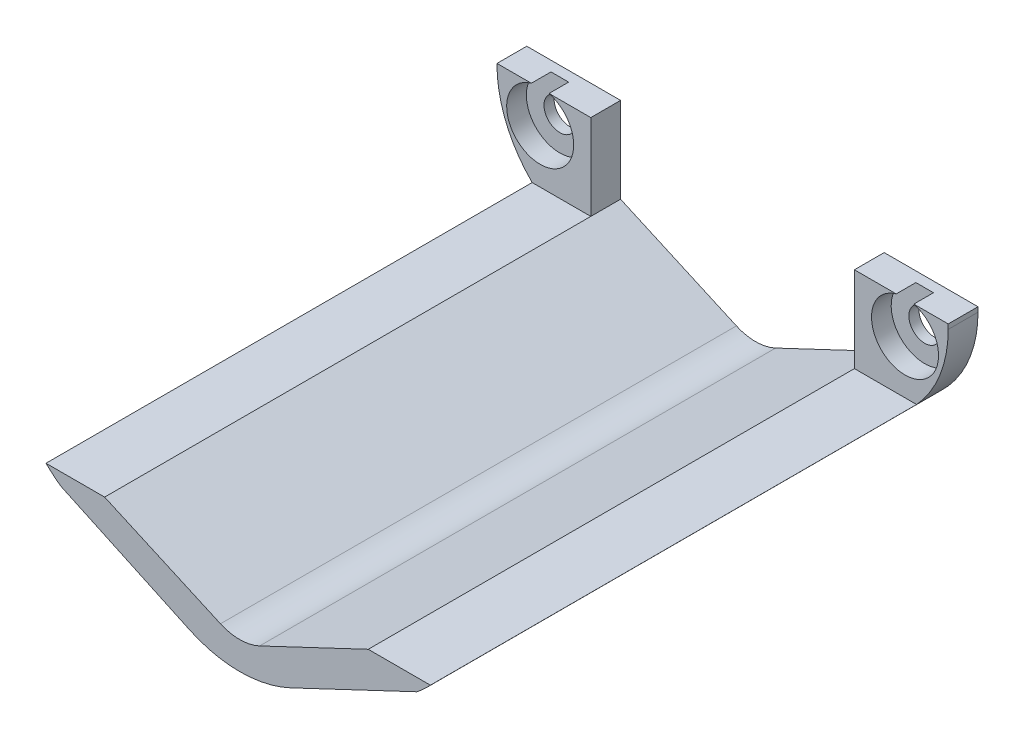
ISO-10303-21;
HEADER;
FILE_DESCRIPTION(('STEP AP214'),'2;1');
FILE_NAME('part.step','',(''),(''),'','','');
FILE_SCHEMA(('AUTOMOTIVE_DESIGN { 1 0 10303 214 1 1 1 1 }'));
ENDSEC;
DATA;
#1=APPLICATION_CONTEXT('core data for automotive mechanical design processes');
#2=APPLICATION_PROTOCOL_DEFINITION('international standard','automotive_design',2000,#1);
#3=PRODUCT_CONTEXT('',#1,'mechanical');
#4=PRODUCT('Part','Part','',(#3));
#5=PRODUCT_RELATED_PRODUCT_CATEGORY('part','',(#4));
#6=PRODUCT_DEFINITION_FORMATION('','',#4);
#7=PRODUCT_DEFINITION_CONTEXT('part definition',#1,'design');
#8=PRODUCT_DEFINITION('design','',#6,#7);
#9=PRODUCT_DEFINITION_SHAPE('','',#8);
#10=(LENGTH_UNIT() NAMED_UNIT(*) SI_UNIT(.MILLI.,.METRE.));
#11=(NAMED_UNIT(*) PLANE_ANGLE_UNIT() SI_UNIT($,.RADIAN.));
#12=(NAMED_UNIT(*) SI_UNIT($,.STERADIAN.) SOLID_ANGLE_UNIT());
#13=UNCERTAINTY_MEASURE_WITH_UNIT(LENGTH_MEASURE(1.E-05),#10,'distance_accuracy_value','');
#14=(GEOMETRIC_REPRESENTATION_CONTEXT(3) GLOBAL_UNCERTAINTY_ASSIGNED_CONTEXT((#13)) GLOBAL_UNIT_ASSIGNED_CONTEXT((#10,
#11,#12)) REPRESENTATION_CONTEXT('',''));
#15=CARTESIAN_POINT('',(0.,0.,0.));
#16=DIRECTION('',(0.,0.,1.));
#17=DIRECTION('',(1.,0.,0.));
#18=AXIS2_PLACEMENT_3D('',#15,#16,#17);
#19=CARTESIAN_POINT('',(-48.895,-29.2595762195122,130.6375));
#20=DIRECTION('',(1.,0.,0.));
#21=DIRECTION('',(0.,0.,-1.));
#22=AXIS2_PLACEMENT_3D('',#19,#20,#21);
#23=PLANE('',#22);
#24=DIRECTION('',(0.,-1.,0.));
#25=VECTOR('',#24,1.);
#26=CARTESIAN_POINT('',(-48.895,-29.2595762195122,26.9875));
#27=LINE('',#26,#25);
#28=CARTESIAN_POINT('',(-48.895,-29.2595762195122,26.9875));
#29=VERTEX_POINT('',#28);
#30=CARTESIAN_POINT('',(-48.895,-29.4891291976606,26.9875));
#31=VERTEX_POINT('',#30);
#32=EDGE_CURVE('E324',#29,#31,#27,.T.);
#33=ORIENTED_EDGE('',*,*,#32,.F.);
#34=DIRECTION('',(0.,0.,-1.));
#35=VECTOR('',#34,1.);
#36=CARTESIAN_POINT('',(-48.895,-29.2595762195122,130.6375));
#37=LINE('',#36,#35);
#38=CARTESIAN_POINT('',(-48.895,-29.2595762195122,20.6375));
#39=VERTEX_POINT('',#38);
#40=EDGE_CURVE('E263',#29,#39,#37,.T.);
#41=ORIENTED_EDGE('',*,*,#40,.T.);
#42=DIRECTION('',(0.,-1.,0.));
#43=VECTOR('',#42,1.);
#44=CARTESIAN_POINT('',(-48.895,-29.2595762195122,20.6375));
#45=LINE('',#44,#43);
#46=CARTESIAN_POINT('',(-48.895,-29.4891291976606,20.6375));
#47=VERTEX_POINT('',#46);
#48=EDGE_CURVE('E294',#39,#47,#45,.T.);
#49=ORIENTED_EDGE('',*,*,#48,.T.);
#50=DIRECTION('',(0.,0.,-1.));
#51=VECTOR('',#50,1.);
#52=CARTESIAN_POINT('',(-48.895,-29.4891291976606,130.6375));
#53=LINE('',#52,#51);
#54=EDGE_CURVE('E220',#47,#31,#53,.F.);
#55=ORIENTED_EDGE('',*,*,#54,.T.);
#56=EDGE_LOOP('',(#33,#41,#49,#55));
#57=FACE_BOUND('',#56,.T.);
#58=ADVANCED_FACE('F33',(#57),#23,.F.);
#59=CARTESIAN_POINT('',(-28.895,-29.2595762195122,130.6375));
#60=DIRECTION('',(1.,0.,0.));
#61=DIRECTION('',(0.,1.,0.));
#62=AXIS2_PLACEMENT_3D('',#59,#60,#61);
#63=PLANE('',#62);
#64=DIRECTION('',(0.,0.,-1.));
#65=VECTOR('',#64,1.);
#66=CARTESIAN_POINT('',(-28.895,-29.2595762195122,130.6375));
#67=LINE('',#66,#65);
#68=CARTESIAN_POINT('',(-28.895,-29.2595762195122,26.9875));
#69=VERTEX_POINT('',#68);
#70=CARTESIAN_POINT('',(-28.895,-29.2595762195122,20.6375));
#71=VERTEX_POINT('',#70);
#72=EDGE_CURVE('E261',#69,#71,#67,.T.);
#73=ORIENTED_EDGE('',*,*,#72,.F.);
#74=DIRECTION('',(0.,1.,0.));
#75=VECTOR('',#74,1.);
#76=CARTESIAN_POINT('',(-28.895,-47.5095762195122,26.9875));
#77=LINE('',#76,#75);
#78=CARTESIAN_POINT('',(-28.895,-47.5095762195122,26.9875));
#79=VERTEX_POINT('',#78);
#80=EDGE_CURVE('E321',#79,#69,#77,.T.);
#81=ORIENTED_EDGE('',*,*,#80,.F.);
#82=DIRECTION('',(0.,0.,-1.));
#83=VECTOR('',#82,1.);
#84=CARTESIAN_POINT('',(-28.895,-47.5095762195122,130.6375));
#85=LINE('',#84,#83);
#86=CARTESIAN_POINT('',(-28.895,-47.5095762195122,20.6375));
#87=VERTEX_POINT('',#86);
#88=EDGE_CURVE('E260',#79,#87,#85,.T.);
#89=ORIENTED_EDGE('',*,*,#88,.T.);
#90=DIRECTION('',(0.,-1.,0.));
#91=VECTOR('',#90,1.);
#92=CARTESIAN_POINT('',(-28.895,-29.2595762195122,20.6375));
#93=LINE('',#92,#91);
#94=EDGE_CURVE('E270',#71,#87,#93,.T.);
#95=ORIENTED_EDGE('',*,*,#94,.F.);
#96=EDGE_LOOP('',(#73,#81,#89,#95));
#97=FACE_BOUND('',#96,.T.);
#98=ADVANCED_FACE('F357',(#97),#63,.T.);
#99=CARTESIAN_POINT('',(-48.895,-29.2595762195122,130.6375));
#100=DIRECTION('',(0.,1.,0.));
#101=DIRECTION('',(-1.,0.,0.));
#102=AXIS2_PLACEMENT_3D('',#99,#100,#101);
#103=PLANE('',#102);
#104=DIRECTION('',(0.,0.,1.));
#105=VECTOR('',#104,1.);
#106=CARTESIAN_POINT('',(-41.5720781813428,-29.2595762195122,26.9875));
#107=LINE('',#106,#105);
#108=CARTESIAN_POINT('',(-41.5720781813428,-29.2595762195122,22.7965));
#109=VERTEX_POINT('',#108);
#110=CARTESIAN_POINT('',(-41.5720781813428,-29.2595762195122,26.9875));
#111=VERTEX_POINT('',#110);
#112=EDGE_CURVE('E11',#109,#111,#107,.T.);
#113=ORIENTED_EDGE('',*,*,#112,.F.);
#114=DIRECTION('',(-1.,0.,0.));
#115=VECTOR('',#114,1.);
#116=CARTESIAN_POINT('',(-48.895,-29.2595762195122,22.7965));
#117=LINE('',#116,#115);
#118=CARTESIAN_POINT('',(-37.7979218186573,-29.2595762195122,22.7965));
#119=VERTEX_POINT('',#118);
#120=EDGE_CURVE('E41',#119,#109,#117,.T.);
#121=ORIENTED_EDGE('',*,*,#120,.F.);
#122=DIRECTION('',(0.,0.,1.));
#123=VECTOR('',#122,1.);
#124=CARTESIAN_POINT('',(-37.7979218186573,-29.2595762195122,26.9875));
#125=LINE('',#124,#123);
#126=CARTESIAN_POINT('',(-37.7979218186573,-29.2595762195122,26.9875));
#127=VERTEX_POINT('',#126);
#128=EDGE_CURVE('E173',#127,#119,#125,.F.);
#129=ORIENTED_EDGE('',*,*,#128,.F.);
#130=DIRECTION('',(-1.,0.,0.));
#131=VECTOR('',#130,1.);
#132=CARTESIAN_POINT('',(-28.895,-29.2595762195122,26.9875));
#133=LINE('',#132,#131);
#134=EDGE_CURVE('E326',#69,#127,#133,.T.);
#135=ORIENTED_EDGE('',*,*,#134,.F.);
#136=ORIENTED_EDGE('',*,*,#72,.T.);
#137=DIRECTION('',(1.,0.,0.));
#138=VECTOR('',#137,1.);
#139=CARTESIAN_POINT('',(-48.895,-29.2595762195122,20.6375));
#140=LINE('',#139,#138);
#141=EDGE_CURVE('E266',#39,#71,#140,.T.);
#142=ORIENTED_EDGE('',*,*,#141,.F.);
#143=ORIENTED_EDGE('',*,*,#40,.F.);
#144=EDGE_CURVE('E328',#111,#29,#133,.T.);
#145=ORIENTED_EDGE('',*,*,#144,.F.);
#146=EDGE_LOOP('',(#113,#121,#129,#135,#136,#142,#143,#145));
#147=FACE_BOUND('',#146,.T.);
#148=ADVANCED_FACE('F189',(#147),#103,.T.);
#149=CARTESIAN_POINT('',(47.3075,-29.2595762195122,130.6375));
#150=DIRECTION('',(1.,0.,0.));
#151=DIRECTION('',(0.,1.,0.));
#152=AXIS2_PLACEMENT_3D('',#149,#150,#151);
#153=PLANE('',#152);
#154=DIRECTION('',(0.,0.,-1.));
#155=VECTOR('',#154,1.);
#156=CARTESIAN_POINT('',(47.3075,-29.2595762195122,130.6375));
#157=LINE('',#156,#155);
#158=CARTESIAN_POINT('',(47.3075,-29.2595762195122,26.9875));
#159=VERTEX_POINT('',#158);
#160=CARTESIAN_POINT('',(47.3075,-29.2595762195122,20.6375));
#161=VERTEX_POINT('',#160);
#162=EDGE_CURVE('E249',#159,#161,#157,.T.);
#163=ORIENTED_EDGE('',*,*,#162,.F.);
#164=DIRECTION('',(0.,1.,0.));
#165=VECTOR('',#164,1.);
#166=CARTESIAN_POINT('',(47.3075,-47.5095762195122,26.9875));
#167=LINE('',#166,#165);
#168=CARTESIAN_POINT('',(47.3075,-30.2699051787882,26.9875));
#169=VERTEX_POINT('',#168);
#170=EDGE_CURVE('E309',#169,#159,#167,.T.);
#171=ORIENTED_EDGE('',*,*,#170,.F.);
#172=DIRECTION('',(0.,0.,1.));
#173=VECTOR('',#172,1.);
#174=CARTESIAN_POINT('',(47.3075,-30.2699051787882,20.6375));
#175=LINE('',#174,#173);
#176=CARTESIAN_POINT('',(47.3075,-30.2699051787882,20.6375));
#177=VERTEX_POINT('',#176);
#178=EDGE_CURVE('E223',#169,#177,#175,.F.);
#179=ORIENTED_EDGE('',*,*,#178,.T.);
#180=DIRECTION('',(0.,-1.,0.));
#181=VECTOR('',#180,1.);
#182=CARTESIAN_POINT('',(47.3075,-29.2595762195122,20.6375));
#183=LINE('',#182,#181);
#184=EDGE_CURVE('E285',#161,#177,#183,.T.);
#185=ORIENTED_EDGE('',*,*,#184,.F.);
#186=EDGE_LOOP('',(#163,#171,#179,#185));
#187=FACE_BOUND('',#186,.T.);
#188=ADVANCED_FACE('F451',(#187),#153,.T.);
#189=CARTESIAN_POINT('',(47.3075,-29.2595762195122,130.6375));
#190=DIRECTION('',(0.,-1.,0.));
#191=DIRECTION('',(1.,0.,0.));
#192=AXIS2_PLACEMENT_3D('',#189,#190,#191);
#193=PLANE('',#192);
#194=DIRECTION('',(1.,0.,0.));
#195=VECTOR('',#194,1.);
#196=CARTESIAN_POINT('',(47.3075,-29.2595762195122,22.7965));
#197=LINE('',#196,#195);
#198=CARTESIAN_POINT('',(36.2224405994751,-29.2595762195122,22.7965));
#199=VERTEX_POINT('',#198);
#200=CARTESIAN_POINT('',(39.977559400525,-29.2595762195122,22.7965));
#201=VERTEX_POINT('',#200);
#202=EDGE_CURVE('E194',#199,#201,#197,.T.);
#203=ORIENTED_EDGE('',*,*,#202,.T.);
#204=DIRECTION('',(0.,0.,1.));
#205=VECTOR('',#204,1.);
#206=CARTESIAN_POINT('',(39.977559400525,-29.2595762195122,26.9875));
#207=LINE('',#206,#205);
#208=CARTESIAN_POINT('',(39.977559400525,-29.2595762195122,26.9875));
#209=VERTEX_POINT('',#208);
#210=EDGE_CURVE('E182',#201,#209,#207,.T.);
#211=ORIENTED_EDGE('',*,*,#210,.T.);
#212=DIRECTION('',(-1.,0.,0.));
#213=VECTOR('',#212,1.);
#214=CARTESIAN_POINT('',(47.3075,-29.2595762195122,26.9875));
#215=LINE('',#214,#213);
#216=EDGE_CURVE('E314',#159,#209,#215,.T.);
#217=ORIENTED_EDGE('',*,*,#216,.F.);
#218=ORIENTED_EDGE('',*,*,#162,.T.);
#219=DIRECTION('',(-1.,0.,0.));
#220=VECTOR('',#219,1.);
#221=CARTESIAN_POINT('',(47.3075,-29.2595762195122,20.6375));
#222=LINE('',#221,#220);
#223=CARTESIAN_POINT('',(27.3075,-29.2595762195122,20.6375));
#224=VERTEX_POINT('',#223);
#225=EDGE_CURVE('E282',#161,#224,#222,.T.);
#226=ORIENTED_EDGE('',*,*,#225,.T.);
#227=DIRECTION('',(0.,0.,-1.));
#228=VECTOR('',#227,1.);
#229=CARTESIAN_POINT('',(27.3075,-29.2595762195122,130.6375));
#230=LINE('',#229,#228);
#231=CARTESIAN_POINT('',(27.3075,-29.2595762195122,26.9875));
#232=VERTEX_POINT('',#231);
#233=EDGE_CURVE('E251',#232,#224,#230,.T.);
#234=ORIENTED_EDGE('',*,*,#233,.F.);
#235=CARTESIAN_POINT('',(36.2224405994751,-29.2595762195122,26.9875));
#236=VERTEX_POINT('',#235);
#237=EDGE_CURVE('E317',#236,#232,#215,.T.);
#238=ORIENTED_EDGE('',*,*,#237,.F.);
#239=DIRECTION('',(0.,0.,1.));
#240=VECTOR('',#239,1.);
#241=CARTESIAN_POINT('',(36.2224405994751,-29.2595762195122,26.9875));
#242=LINE('',#241,#240);
#243=EDGE_CURVE('E197',#236,#199,#242,.F.);
#244=ORIENTED_EDGE('',*,*,#243,.T.);
#245=EDGE_LOOP('',(#203,#211,#217,#218,#226,#234,#238,#244));
#246=FACE_BOUND('',#245,.T.);
#247=ADVANCED_FACE('F446',(#246),#193,.F.);
#248=CARTESIAN_POINT('',(27.3075,-29.2595762195122,130.6375));
#249=DIRECTION('',(1.,0.,0.));
#250=DIRECTION('',(0.,1.,0.));
#251=AXIS2_PLACEMENT_3D('',#248,#249,#250);
#252=PLANE('',#251);
#253=DIRECTION('',(0.,-1.,0.));
#254=VECTOR('',#253,1.);
#255=CARTESIAN_POINT('',(27.3075,-29.2595762195122,26.9875));
#256=LINE('',#255,#254);
#257=CARTESIAN_POINT('',(27.3075,-47.5095762195122,26.9875));
#258=VERTEX_POINT('',#257);
#259=EDGE_CURVE('E312',#232,#258,#256,.T.);
#260=ORIENTED_EDGE('',*,*,#259,.F.);
#261=ORIENTED_EDGE('',*,*,#233,.T.);
#262=DIRECTION('',(0.,-1.,0.));
#263=VECTOR('',#262,1.);
#264=CARTESIAN_POINT('',(27.3075,-29.2595762195122,20.6375));
#265=LINE('',#264,#263);
#266=CARTESIAN_POINT('',(27.3075,-47.5095762195122,20.6375));
#267=VERTEX_POINT('',#266);
#268=EDGE_CURVE('E279',#224,#267,#265,.T.);
#269=ORIENTED_EDGE('',*,*,#268,.T.);
#270=DIRECTION('',(0.,0.,-1.));
#271=VECTOR('',#270,1.);
#272=CARTESIAN_POINT('',(27.3075,-47.5095762195122,130.6375));
#273=LINE('',#272,#271);
#274=EDGE_CURVE('E256',#258,#267,#273,.T.);
#275=ORIENTED_EDGE('',*,*,#274,.F.);
#276=EDGE_LOOP('',(#260,#261,#269,#275));
#277=FACE_BOUND('',#276,.T.);
#278=ADVANCED_FACE('F442',(#277),#252,.F.);
#279=CARTESIAN_POINT('',(-38.2625152899549,-50.1550550699981,130.6375));
#280=DIRECTION('',(0.422618261740697,0.906307787036651,0.));
#281=DIRECTION('',(-0.906307787036651,0.422618261740697,0.));
#282=AXIS2_PLACEMENT_3D('',#279,#280,#281);
#283=PLANE('',#282);
#284=DIRECTION('',(0.906307787036651,-0.422618261740697,0.));
#285=VECTOR('',#284,1.);
#286=CARTESIAN_POINT('',(-38.2625152899549,-50.1550550699981,20.6375));
#287=LINE('',#286,#285);
#288=CARTESIAN_POINT('',(-38.2625152899549,-50.1550550699981,20.6375));
#289=VERTEX_POINT('',#288);
#290=CARTESIAN_POINT('',(-10.8129404112503,-62.9550020490371,20.6375));
#291=VERTEX_POINT('',#290);
#292=EDGE_CURVE('E291',#289,#291,#287,.T.);
#293=ORIENTED_EDGE('',*,*,#292,.T.);
#294=DIRECTION('',(0.,0.,-1.));
#295=VECTOR('',#294,1.);
#296=CARTESIAN_POINT('',(-10.8129404112503,-62.9550020490371,130.6375));
#297=LINE('',#296,#295);
#298=CARTESIAN_POINT('',(-10.8129404112503,-62.9550020490371,130.6375));
#299=VERTEX_POINT('',#298);
#300=EDGE_CURVE('E232',#291,#299,#297,.F.);
#301=ORIENTED_EDGE('',*,*,#300,.T.);
#302=DIRECTION('',(0.906307787036651,-0.422618261740697,0.));
#303=VECTOR('',#302,1.);
#304=CARTESIAN_POINT('',(-38.2625152899549,-50.1550550699981,130.6375));
#305=LINE('',#304,#303);
#306=CARTESIAN_POINT('',(-38.2625152899549,-50.1550550699981,130.6375));
#307=VERTEX_POINT('',#306);
#308=EDGE_CURVE('E269',#307,#299,#305,.T.);
#309=ORIENTED_EDGE('',*,*,#308,.F.);
#310=DIRECTION('',(0.,0.,-1.));
#311=VECTOR('',#310,1.);
#312=CARTESIAN_POINT('',(-38.2625152899549,-50.1550550699981,130.6375));
#313=LINE('',#312,#311);
#314=EDGE_CURVE('E243',#307,#289,#313,.T.);
#315=ORIENTED_EDGE('',*,*,#314,.T.);
#316=EDGE_LOOP('',(#293,#301,#309,#315));
#317=FACE_BOUND('',#316,.T.);
#318=ADVANCED_FACE('F368',(#317),#283,.F.);
#319=CARTESIAN_POINT('',(0.,-67.9971589699767,130.6375));
#320=DIRECTION('',(-0.427678023121791,0.90393114148072,0.));
#321=DIRECTION('',(-0.90393114148072,-0.427678023121791,0.));
#322=AXIS2_PLACEMENT_3D('',#319,#320,#321);
#323=PLANE('',#322);
#324=DIRECTION('',(0.90393114148072,0.427678023121791,0.));
#325=VECTOR('',#324,1.);
#326=CARTESIAN_POINT('',(0.,-67.9971589699767,130.6375));
#327=LINE('',#326,#325);
#328=CARTESIAN_POINT('',(10.7845852242569,-62.8946352519164,130.6375));
#329=VERTEX_POINT('',#328);
#330=CARTESIAN_POINT('',(37.7106899882307,-50.1550550699981,130.6375));
#331=VERTEX_POINT('',#330);
#332=EDGE_CURVE('E303',#329,#331,#327,.T.);
#333=ORIENTED_EDGE('',*,*,#332,.F.);
#334=DIRECTION('',(0.,0.,-1.));
#335=VECTOR('',#334,1.);
#336=CARTESIAN_POINT('',(10.7845852242569,-62.8946352519164,130.6375));
#337=LINE('',#336,#335);
#338=CARTESIAN_POINT('',(10.7845852242569,-62.8946352519164,20.6375));
#339=VERTEX_POINT('',#338);
#340=EDGE_CURVE('E240',#329,#339,#337,.T.);
#341=ORIENTED_EDGE('',*,*,#340,.T.);
#342=DIRECTION('',(0.90393114148072,0.427678023121791,0.));
#343=VECTOR('',#342,1.);
#344=CARTESIAN_POINT('',(0.,-67.9971589699767,20.6375));
#345=LINE('',#344,#343);
#346=CARTESIAN_POINT('',(37.7106899882307,-50.1550550699981,20.6375));
#347=VERTEX_POINT('',#346);
#348=EDGE_CURVE('E288',#339,#347,#345,.T.);
#349=ORIENTED_EDGE('',*,*,#348,.T.);
#350=DIRECTION('',(0.,0.,-1.));
#351=VECTOR('',#350,1.);
#352=CARTESIAN_POINT('',(37.7106899882307,-50.1550550699981,130.6375));
#353=LINE('',#352,#351);
#354=EDGE_CURVE('E246',#331,#347,#353,.T.);
#355=ORIENTED_EDGE('',*,*,#354,.F.);
#356=EDGE_LOOP('',(#333,#341,#349,#355));
#357=FACE_BOUND('',#356,.T.);
#358=ADVANCED_FACE('F422',(#357),#323,.F.);
#359=CARTESIAN_POINT('',(27.3075,-47.5095762195122,130.6375));
#360=DIRECTION('',(0.427678023121791,-0.90393114148072,0.));
#361=DIRECTION('',(0.90393114148072,0.427678023121791,0.));
#362=AXIS2_PLACEMENT_3D('',#359,#360,#361);
#363=PLANE('',#362);
#364=DIRECTION('',(-0.90393114148072,-0.427678023121791,0.));
#365=VECTOR('',#364,1.);
#366=CARTESIAN_POINT('',(27.3075,-47.5095762195122,20.6375));
#367=LINE('',#366,#365);
#368=CARTESIAN_POINT('',(4.15871666990052,-58.4619877893516,20.6375));
#369=VERTEX_POINT('',#368);
#370=EDGE_CURVE('E276',#267,#369,#367,.T.);
#371=ORIENTED_EDGE('',*,*,#370,.T.);
#372=DIRECTION('',(0.,0.,-1.));
#373=VECTOR('',#372,1.);
#374=CARTESIAN_POINT('',(4.15871666990052,-58.4619877893516,130.6375));
#375=LINE('',#374,#373);
#376=CARTESIAN_POINT('',(4.15871666990052,-58.4619877893516,130.6375));
#377=VERTEX_POINT('',#376);
#378=EDGE_CURVE('E215',#369,#377,#375,.F.);
#379=ORIENTED_EDGE('',*,*,#378,.T.);
#380=DIRECTION('',(-0.90393114148072,-0.427678023121791,0.));
#381=VECTOR('',#380,1.);
#382=CARTESIAN_POINT('',(27.3075,-47.5095762195122,130.6375));
#383=LINE('',#382,#381);
#384=CARTESIAN_POINT('',(27.3075,-47.5095762195122,130.6375));
#385=VERTEX_POINT('',#384);
#386=EDGE_CURVE('E300',#385,#377,#383,.T.);
#387=ORIENTED_EDGE('',*,*,#386,.F.);
#388=EDGE_CURVE('E253',#385,#258,#273,.T.);
#389=ORIENTED_EDGE('',*,*,#388,.T.);
#390=ORIENTED_EDGE('',*,*,#274,.T.);
#391=EDGE_LOOP('',(#371,#379,#387,#389,#390));
#392=FACE_BOUND('',#391,.T.);
#393=ADVANCED_FACE('F434',(#392),#363,.F.);
#394=CARTESIAN_POINT('',(0.,-60.4296063860439,130.6375));
#395=DIRECTION('',(-0.40819019229647,-0.912896909247135,0.));
#396=DIRECTION('',(0.912896909247135,-0.40819019229647,0.));
#397=AXIS2_PLACEMENT_3D('',#394,#395,#396);
#398=PLANE('',#397);
#399=DIRECTION('',(-0.912896909247134,0.40819019229647,0.));
#400=VECTOR('',#399,1.);
#401=CARTESIAN_POINT('',(0.,-60.4296063860439,130.6375));
#402=LINE('',#401,#400);
#403=CARTESIAN_POINT('',(-4.19996548428209,-58.5516454670158,130.6375));
#404=VERTEX_POINT('',#403);
#405=CARTESIAN_POINT('',(-28.895,-47.5095762195122,130.6375));
#406=VERTEX_POINT('',#405);
#407=EDGE_CURVE('E265',#404,#406,#402,.T.);
#408=ORIENTED_EDGE('',*,*,#407,.F.);
#409=DIRECTION('',(0.,0.,-1.));
#410=VECTOR('',#409,1.);
#411=CARTESIAN_POINT('',(-4.19996548428209,-58.5516454670158,20.6375));
#412=LINE('',#411,#410);
#413=CARTESIAN_POINT('',(-4.19996548428209,-58.5516454670158,20.6375));
#414=VERTEX_POINT('',#413);
#415=EDGE_CURVE('E217',#404,#414,#412,.T.);
#416=ORIENTED_EDGE('',*,*,#415,.T.);
#417=DIRECTION('',(-0.912896909247134,0.40819019229647,0.));
#418=VECTOR('',#417,1.);
#419=CARTESIAN_POINT('',(0.,-60.4296063860439,20.6375));
#420=LINE('',#419,#418);
#421=EDGE_CURVE('E273',#414,#87,#420,.T.);
#422=ORIENTED_EDGE('',*,*,#421,.T.);
#423=ORIENTED_EDGE('',*,*,#88,.F.);
#424=EDGE_CURVE('E257',#406,#79,#85,.T.);
#425=ORIENTED_EDGE('',*,*,#424,.F.);
#426=EDGE_LOOP('',(#408,#416,#422,#423,#425));
#427=FACE_BOUND('',#426,.T.);
#428=ADVANCED_FACE('F403',(#427),#398,.F.);
#429=CARTESIAN_POINT('',(0.,0.,130.6375));
#430=DIRECTION('',(0.,0.,1.));
#431=DIRECTION('',(1.,0.,0.));
#432=AXIS2_PLACEMENT_3D('',#429,#430,#431);
#433=PLANE('',#432);
#434=DIRECTION('',(1.,0.,0.));
#435=VECTOR('',#434,1.);
#436=CARTESIAN_POINT('',(-48.895,-47.5095762195122,130.6375));
#437=LINE('',#436,#435);
#438=CARTESIAN_POINT('',(-41.395376787449,-47.5095762195122,130.6375));
#439=VERTEX_POINT('',#438);
#440=EDGE_CURVE('E319',#439,#406,#437,.T.);
#441=ORIENTED_EDGE('',*,*,#440,.F.);
#442=CARTESIAN_POINT('',(-23.495,-29.4891291976606,130.6375));
#443=DIRECTION('',(0.,0.,1.));
#444=DIRECTION('',(1.,0.,0.));
#445=AXIS2_PLACEMENT_3D('',#442,#443,#444);
#446=CIRCLE('',#445,25.4);
#447=EDGE_CURVE('E230',#439,#307,#446,.T.);
#448=ORIENTED_EDGE('',*,*,#447,.T.);
#449=ORIENTED_EDGE('',*,*,#308,.T.);
#450=CARTESIAN_POINT('',(-0.0784365630365769,-39.9347842583061,130.6375));
#451=DIRECTION('',(0.,0.,1.));
#452=DIRECTION('',(1.,0.,0.));
#453=AXIS2_PLACEMENT_3D('',#450,#451,#452);
#454=CIRCLE('',#453,25.4);
#455=EDGE_CURVE('E225',#299,#329,#454,.T.);
#456=ORIENTED_EDGE('',*,*,#455,.T.);
#457=ORIENTED_EDGE('',*,*,#332,.T.);
#458=CARTESIAN_POINT('',(21.9075,-30.2699051787882,130.6375));
#459=DIRECTION('',(0.,0.,1.));
#460=DIRECTION('',(1.,0.,0.));
#461=AXIS2_PLACEMENT_3D('',#458,#459,#460);
#462=CIRCLE('',#461,25.4);
#463=CARTESIAN_POINT('',(40.5610182313585,-47.5095762195122,130.6375));
#464=VERTEX_POINT('',#463);
#465=EDGE_CURVE('E227',#331,#464,#462,.T.);
#466=ORIENTED_EDGE('',*,*,#465,.T.);
#467=DIRECTION('',(1.,0.,0.));
#468=VECTOR('',#467,1.);
#469=CARTESIAN_POINT('',(27.3075,-47.5095762195122,130.6375));
#470=LINE('',#469,#468);
#471=EDGE_CURVE('E307',#385,#464,#470,.T.);
#472=ORIENTED_EDGE('',*,*,#471,.F.);
#473=ORIENTED_EDGE('',*,*,#386,.T.);
#474=CARTESIAN_POINT('',(-0.118063561317389,-49.4226763745444,130.6375));
#475=DIRECTION('',(0.,0.,1.));
#476=DIRECTION('',(1.,0.,0.));
#477=AXIS2_PLACEMENT_3D('',#474,#475,#476);
#478=CIRCLE('',#477,10.);
#479=EDGE_CURVE('E211',#377,#404,#478,.F.);
#480=ORIENTED_EDGE('',*,*,#479,.T.);
#481=ORIENTED_EDGE('',*,*,#407,.T.);
#482=EDGE_LOOP('',(#441,#448,#449,#456,#457,#466,#472,#473,#480,#481));
#483=FACE_BOUND('',#482,.T.);
#484=ADVANCED_FACE('F395',(#483),#433,.T.);
#485=CARTESIAN_POINT('',(0.,0.,20.6375));
#486=DIRECTION('',(0.,0.,1.));
#487=DIRECTION('',(1.,0.,0.));
#488=AXIS2_PLACEMENT_3D('',#485,#486,#487);
#489=PLANE('',#488);
#490=CARTESIAN_POINT('',(-39.685,-36.1495762195122,20.6375));
#491=DIRECTION('',(0.,0.,1.));
#492=DIRECTION('',(1.,0.,0.));
#493=AXIS2_PLACEMENT_3D('',#490,#491,#492);
#494=CIRCLE('',#493,3.3782);
#495=CARTESIAN_POINT('',(-36.3068,-36.1495762195122,20.6375));
#496=VERTEX_POINT('',#495);
#497=EDGE_CURVE('E338',#496,#496,#494,.T.);
#498=ORIENTED_EDGE('',*,*,#497,.T.);
#499=EDGE_LOOP('',(#498));
#500=FACE_BOUND('',#499,.T.);
#501=CARTESIAN_POINT('',(38.1,-36.1521762195122,20.6375));
#502=DIRECTION('',(0.,0.,1.));
#503=DIRECTION('',(1.,0.,0.));
#504=AXIS2_PLACEMENT_3D('',#501,#502,#503);
#505=CIRCLE('',#504,3.3782);
#506=CARTESIAN_POINT('',(41.4782,-36.1521762195122,20.6375));
#507=VERTEX_POINT('',#506);
#508=EDGE_CURVE('E322',#507,#507,#505,.T.);
#509=ORIENTED_EDGE('',*,*,#508,.T.);
#510=EDGE_LOOP('',(#509));
#511=FACE_BOUND('',#510,.T.);
#512=ORIENTED_EDGE('',*,*,#348,.F.);
#513=CARTESIAN_POINT('',(-0.0784365630365769,-39.9347842583061,20.6375));
#514=DIRECTION('',(0.,0.,1.));
#515=DIRECTION('',(1.,0.,0.));
#516=AXIS2_PLACEMENT_3D('',#513,#514,#515);
#517=CIRCLE('',#516,25.4);
#518=EDGE_CURVE('E234',#339,#291,#517,.F.);
#519=ORIENTED_EDGE('',*,*,#518,.T.);
#520=ORIENTED_EDGE('',*,*,#292,.F.);
#521=CARTESIAN_POINT('',(-23.495,-29.4891291976606,20.6375));
#522=DIRECTION('',(0.,0.,1.));
#523=DIRECTION('',(1.,0.,0.));
#524=AXIS2_PLACEMENT_3D('',#521,#522,#523);
#525=CIRCLE('',#524,25.4);
#526=EDGE_CURVE('E238',#289,#47,#525,.F.);
#527=ORIENTED_EDGE('',*,*,#526,.T.);
#528=ORIENTED_EDGE('',*,*,#48,.F.);
#529=ORIENTED_EDGE('',*,*,#141,.T.);
#530=ORIENTED_EDGE('',*,*,#94,.T.);
#531=ORIENTED_EDGE('',*,*,#421,.F.);
#532=CARTESIAN_POINT('',(-0.118063561317389,-49.4226763745444,20.6375));
#533=DIRECTION('',(0.,0.,1.));
#534=DIRECTION('',(1.,0.,0.));
#535=AXIS2_PLACEMENT_3D('',#532,#533,#534);
#536=CIRCLE('',#535,10.);
#537=EDGE_CURVE('E213',#414,#369,#536,.T.);
#538=ORIENTED_EDGE('',*,*,#537,.T.);
#539=ORIENTED_EDGE('',*,*,#370,.F.);
#540=ORIENTED_EDGE('',*,*,#268,.F.);
#541=ORIENTED_EDGE('',*,*,#225,.F.);
#542=ORIENTED_EDGE('',*,*,#184,.T.);
#543=CARTESIAN_POINT('',(21.9075,-30.2699051787882,20.6375));
#544=DIRECTION('',(0.,0.,1.));
#545=DIRECTION('',(1.,0.,0.));
#546=AXIS2_PLACEMENT_3D('',#543,#544,#545);
#547=CIRCLE('',#546,25.4);
#548=EDGE_CURVE('E236',#177,#347,#547,.F.);
#549=ORIENTED_EDGE('',*,*,#548,.T.);
#550=EDGE_LOOP('',(#512,#519,#520,#527,#528,#529,#530,#531,#538,#539,#540,#541,#542,#549));
#551=FACE_BOUND('',#550,.T.);
#552=ADVANCED_FACE('F374',(#500,#511,#551),#489,.F.);
#553=CARTESIAN_POINT('',(-0.0784365630365769,-39.9347842583061,130.6375));
#554=DIRECTION('',(0.,0.,-1.));
#555=DIRECTION('',(-1.,0.,0.));
#556=AXIS2_PLACEMENT_3D('',#553,#554,#555);
#557=CYLINDRICAL_SURFACE('',#556,25.4);
#558=ORIENTED_EDGE('',*,*,#455,.F.);
#559=ORIENTED_EDGE('',*,*,#300,.F.);
#560=ORIENTED_EDGE('',*,*,#518,.F.);
#561=ORIENTED_EDGE('',*,*,#340,.F.);
#562=EDGE_LOOP('',(#558,#559,#560,#561));
#563=FACE_BOUND('',#562,.T.);
#564=ADVANCED_FACE('F370',(#563),#557,.T.);
#565=CARTESIAN_POINT('',(21.9075,-30.2699051787882,130.6375));
#566=DIRECTION('',(0.,0.,-1.));
#567=DIRECTION('',(-1.,0.,0.));
#568=AXIS2_PLACEMENT_3D('',#565,#566,#567);
#569=CYLINDRICAL_SURFACE('',#568,25.4);
#570=DIRECTION('',(0.,0.,-1.));
#571=VECTOR('',#570,1.);
#572=CARTESIAN_POINT('',(40.5610182313585,-47.5095762195122,130.6375));
#573=LINE('',#572,#571);
#574=CARTESIAN_POINT('',(40.5610182313585,-47.5095762195122,26.9875));
#575=VERTEX_POINT('',#574);
#576=EDGE_CURVE('E205',#464,#575,#573,.T.);
#577=ORIENTED_EDGE('',*,*,#576,.F.);
#578=ORIENTED_EDGE('',*,*,#465,.F.);
#579=ORIENTED_EDGE('',*,*,#354,.T.);
#580=ORIENTED_EDGE('',*,*,#548,.F.);
#581=ORIENTED_EDGE('',*,*,#178,.F.);
#582=CARTESIAN_POINT('',(21.9075,-30.2699051787882,26.9875));
#583=DIRECTION('',(0.,0.,1.));
#584=DIRECTION('',(1.,0.,0.));
#585=AXIS2_PLACEMENT_3D('',#582,#583,#584);
#586=CIRCLE('',#585,25.4);
#587=EDGE_CURVE('E208',#169,#575,#586,.F.);
#588=ORIENTED_EDGE('',*,*,#587,.T.);
#589=EDGE_LOOP('',(#577,#578,#579,#580,#581,#588));
#590=FACE_BOUND('',#589,.T.);
#591=ADVANCED_FACE('F373',(#590),#569,.T.);
#592=CARTESIAN_POINT('',(-23.495,-29.4891291976606,130.6375));
#593=DIRECTION('',(0.,0.,-1.));
#594=DIRECTION('',(-1.,0.,0.));
#595=AXIS2_PLACEMENT_3D('',#592,#593,#594);
#596=CYLINDRICAL_SURFACE('',#595,25.4);
#597=DIRECTION('',(0.,0.,-1.));
#598=VECTOR('',#597,1.);
#599=CARTESIAN_POINT('',(-41.395376787449,-47.5095762195122,130.6375));
#600=LINE('',#599,#598);
#601=CARTESIAN_POINT('',(-41.395376787449,-47.5095762195122,26.9875));
#602=VERTEX_POINT('',#601);
#603=EDGE_CURVE('E200',#602,#439,#600,.F.);
#604=ORIENTED_EDGE('',*,*,#603,.F.);
#605=CARTESIAN_POINT('',(-23.495,-29.4891291976606,26.9875));
#606=DIRECTION('',(0.,0.,1.));
#607=DIRECTION('',(1.,0.,0.));
#608=AXIS2_PLACEMENT_3D('',#605,#606,#607);
#609=CIRCLE('',#608,25.4);
#610=EDGE_CURVE('E202',#602,#31,#609,.F.);
#611=ORIENTED_EDGE('',*,*,#610,.T.);
#612=ORIENTED_EDGE('',*,*,#54,.F.);
#613=ORIENTED_EDGE('',*,*,#526,.F.);
#614=ORIENTED_EDGE('',*,*,#314,.F.);
#615=ORIENTED_EDGE('',*,*,#447,.F.);
#616=EDGE_LOOP('',(#604,#611,#612,#613,#614,#615));
#617=FACE_BOUND('',#616,.T.);
#618=ADVANCED_FACE('F377',(#617),#596,.T.);
#619=CARTESIAN_POINT('',(-0.118063561317389,-49.4226763745444,130.6375));
#620=DIRECTION('',(0.,0.,1.));
#621=DIRECTION('',(1.,0.,0.));
#622=AXIS2_PLACEMENT_3D('',#619,#620,#621);
#623=CYLINDRICAL_SURFACE('',#622,10.);
#624=ORIENTED_EDGE('',*,*,#479,.F.);
#625=ORIENTED_EDGE('',*,*,#378,.F.);
#626=ORIENTED_EDGE('',*,*,#537,.F.);
#627=ORIENTED_EDGE('',*,*,#415,.F.);
#628=EDGE_LOOP('',(#624,#625,#626,#627));
#629=FACE_BOUND('',#628,.T.);
#630=ADVANCED_FACE('F35',(#629),#623,.F.);
#631=CARTESIAN_POINT('',(27.3075,-47.5095762195122,26.9875));
#632=DIRECTION('',(0.,-1.,0.));
#633=DIRECTION('',(0.,0.,-1.));
#634=AXIS2_PLACEMENT_3D('',#631,#632,#633);
#635=PLANE('',#634);
#636=ORIENTED_EDGE('',*,*,#576,.T.);
#637=DIRECTION('',(1.,0.,0.));
#638=VECTOR('',#637,1.);
#639=CARTESIAN_POINT('',(27.3075,-47.5095762195122,26.9875));
#640=LINE('',#639,#638);
#641=EDGE_CURVE('E297',#258,#575,#640,.T.);
#642=ORIENTED_EDGE('',*,*,#641,.F.);
#643=ORIENTED_EDGE('',*,*,#388,.F.);
#644=ORIENTED_EDGE('',*,*,#471,.T.);
#645=EDGE_LOOP('',(#636,#642,#643,#644));
#646=FACE_BOUND('',#645,.T.);
#647=ADVANCED_FACE('F384',(#646),#635,.F.);
#648=CARTESIAN_POINT('',(0.,0.,26.9875));
#649=DIRECTION('',(0.,0.,1.));
#650=DIRECTION('',(1.,0.,0.));
#651=AXIS2_PLACEMENT_3D('',#648,#649,#650);
#652=PLANE('',#651);
#653=CARTESIAN_POINT('',(38.1,-36.1521762195122,26.9875));
#654=DIRECTION('',(0.,0.,1.));
#655=DIRECTION('',(1.,0.,0.));
#656=AXIS2_PLACEMENT_3D('',#653,#654,#655);
#657=CIRCLE('',#656,7.14374999999999);
#658=EDGE_CURVE('E336',#236,#209,#657,.T.);
#659=ORIENTED_EDGE('',*,*,#658,.F.);
#660=ORIENTED_EDGE('',*,*,#237,.T.);
#661=ORIENTED_EDGE('',*,*,#259,.T.);
#662=ORIENTED_EDGE('',*,*,#641,.T.);
#663=ORIENTED_EDGE('',*,*,#587,.F.);
#664=ORIENTED_EDGE('',*,*,#170,.T.);
#665=ORIENTED_EDGE('',*,*,#216,.T.);
#666=EDGE_LOOP('',(#659,#660,#661,#662,#663,#664,#665));
#667=FACE_BOUND('',#666,.T.);
#668=ADVANCED_FACE('F454',(#667),#652,.T.);
#669=CARTESIAN_POINT('',(-48.895,-47.5095762195122,26.9875));
#670=DIRECTION('',(0.,-1.,0.));
#671=DIRECTION('',(1.,0.,0.));
#672=AXIS2_PLACEMENT_3D('',#669,#670,#671);
#673=PLANE('',#672);
#674=ORIENTED_EDGE('',*,*,#603,.T.);
#675=ORIENTED_EDGE('',*,*,#440,.T.);
#676=ORIENTED_EDGE('',*,*,#424,.T.);
#677=DIRECTION('',(1.,0.,0.));
#678=VECTOR('',#677,1.);
#679=CARTESIAN_POINT('',(-48.895,-47.5095762195122,26.9875));
#680=LINE('',#679,#678);
#681=EDGE_CURVE('E310',#602,#79,#680,.T.);
#682=ORIENTED_EDGE('',*,*,#681,.F.);
#683=EDGE_LOOP('',(#674,#675,#676,#682));
#684=FACE_BOUND('',#683,.T.);
#685=ADVANCED_FACE('F393',(#684),#673,.F.);
#686=CARTESIAN_POINT('',(0.,0.,26.9875));
#687=DIRECTION('',(0.,0.,1.));
#688=DIRECTION('',(1.,0.,0.));
#689=AXIS2_PLACEMENT_3D('',#686,#687,#688);
#690=PLANE('',#689);
#691=CARTESIAN_POINT('',(-39.685,-36.1495762195122,26.9875));
#692=DIRECTION('',(0.,0.,1.));
#693=DIRECTION('',(1.,0.,0.));
#694=AXIS2_PLACEMENT_3D('',#691,#692,#693);
#695=CIRCLE('',#694,7.14374999999999);
#696=EDGE_CURVE('E47',#111,#127,#695,.T.);
#697=ORIENTED_EDGE('',*,*,#696,.F.);
#698=ORIENTED_EDGE('',*,*,#144,.T.);
#699=ORIENTED_EDGE('',*,*,#32,.T.);
#700=ORIENTED_EDGE('',*,*,#610,.F.);
#701=ORIENTED_EDGE('',*,*,#681,.T.);
#702=ORIENTED_EDGE('',*,*,#80,.T.);
#703=ORIENTED_EDGE('',*,*,#134,.T.);
#704=EDGE_LOOP('',(#697,#698,#699,#700,#701,#702,#703));
#705=FACE_BOUND('',#704,.T.);
#706=ADVANCED_FACE('F408',(#705),#690,.T.);
#707=CARTESIAN_POINT('',(41.4782,-36.1521762195122,22.7965));
#708=DIRECTION('',(0.,0.,-1.));
#709=DIRECTION('',(-1.,0.,0.));
#710=AXIS2_PLACEMENT_3D('',#707,#708,#709);
#711=PLANE('',#710);
#712=CARTESIAN_POINT('',(38.1,-36.1521762195122,22.7965));
#713=DIRECTION('',(0.,0.,1.));
#714=DIRECTION('',(1.,0.,0.));
#715=AXIS2_PLACEMENT_3D('',#712,#713,#714);
#716=CIRCLE('',#715,3.3782);
#717=CARTESIAN_POINT('',(41.4782,-36.1521762195122,22.7965));
#718=VERTEX_POINT('',#717);
#719=EDGE_CURVE('E332',#718,#718,#716,.T.);
#720=ORIENTED_EDGE('',*,*,#719,.F.);
#721=EDGE_LOOP('',(#720));
#722=FACE_BOUND('',#721,.T.);
#723=CARTESIAN_POINT('',(38.1,-36.1521762195122,22.7965));
#724=DIRECTION('',(0.,0.,1.));
#725=DIRECTION('',(1.,0.,0.));
#726=AXIS2_PLACEMENT_3D('',#723,#724,#725);
#727=CIRCLE('',#726,7.14375);
#728=EDGE_CURVE('E55',#199,#201,#727,.T.);
#729=ORIENTED_EDGE('',*,*,#728,.T.);
#730=ORIENTED_EDGE('',*,*,#202,.F.);
#731=EDGE_LOOP('',(#729,#730));
#732=FACE_BOUND('',#731,.T.);
#733=ADVANCED_FACE('F457',(#722,#732),#711,.F.);
#734=CARTESIAN_POINT('',(38.1,-36.1521762195122,26.9875));
#735=DIRECTION('',(0.,0.,1.));
#736=DIRECTION('',(1.,0.,0.));
#737=AXIS2_PLACEMENT_3D('',#734,#735,#736);
#738=CYLINDRICAL_SURFACE('',#737,7.14374999999999);
#739=ORIENTED_EDGE('',*,*,#728,.F.);
#740=ORIENTED_EDGE('',*,*,#243,.F.);
#741=ORIENTED_EDGE('',*,*,#658,.T.);
#742=ORIENTED_EDGE('',*,*,#210,.F.);
#743=EDGE_LOOP('',(#739,#740,#741,#742));
#744=FACE_BOUND('',#743,.T.);
#745=ADVANCED_FACE('F455',(#744),#738,.F.);
#746=CARTESIAN_POINT('',(38.1,-36.1521762195122,26.9875));
#747=DIRECTION('',(0.,0.,1.));
#748=DIRECTION('',(1.,0.,0.));
#749=AXIS2_PLACEMENT_3D('',#746,#747,#748);
#750=CYLINDRICAL_SURFACE('',#749,3.3782);
#751=ORIENTED_EDGE('',*,*,#508,.F.);
#752=EDGE_LOOP('',(#751));
#753=FACE_BOUND('',#752,.T.);
#754=ORIENTED_EDGE('',*,*,#719,.T.);
#755=EDGE_LOOP('',(#754));
#756=FACE_BOUND('',#755,.T.);
#757=ADVANCED_FACE('F353',(#753,#756),#750,.F.);
#758=CARTESIAN_POINT('',(-39.685,-36.1495762195122,26.9875));
#759=DIRECTION('',(0.,0.,1.));
#760=DIRECTION('',(1.,0.,0.));
#761=AXIS2_PLACEMENT_3D('',#758,#759,#760);
#762=CYLINDRICAL_SURFACE('',#761,3.3782);
#763=ORIENTED_EDGE('',*,*,#497,.F.);
#764=EDGE_LOOP('',(#763));
#765=FACE_BOUND('',#764,.T.);
#766=CARTESIAN_POINT('',(-39.685,-36.1495762195122,22.7965));
#767=DIRECTION('',(0.,0.,1.));
#768=DIRECTION('',(1.,0.,0.));
#769=AXIS2_PLACEMENT_3D('',#766,#767,#768);
#770=CIRCLE('',#769,3.3782);
#771=CARTESIAN_POINT('',(-36.3068,-36.1495762195122,22.7965));
#772=VERTEX_POINT('',#771);
#773=EDGE_CURVE('E187',#772,#772,#770,.T.);
#774=ORIENTED_EDGE('',*,*,#773,.T.);
#775=EDGE_LOOP('',(#774));
#776=FACE_BOUND('',#775,.T.);
#777=ADVANCED_FACE('F345',(#765,#776),#762,.F.);
#778=CARTESIAN_POINT('',(-36.3068,-36.1495762195122,22.7965));
#779=DIRECTION('',(0.,0.,-1.));
#780=DIRECTION('',(-1.,0.,0.));
#781=AXIS2_PLACEMENT_3D('',#778,#779,#780);
#782=PLANE('',#781);
#783=ORIENTED_EDGE('',*,*,#120,.T.);
#784=CARTESIAN_POINT('',(-39.685,-36.1495762195122,22.7965));
#785=DIRECTION('',(0.,0.,1.));
#786=DIRECTION('',(1.,0.,0.));
#787=AXIS2_PLACEMENT_3D('',#784,#785,#786);
#788=CIRCLE('',#787,7.14375);
#789=EDGE_CURVE('E176',#109,#119,#788,.T.);
#790=ORIENTED_EDGE('',*,*,#789,.T.);
#791=EDGE_LOOP('',(#783,#790));
#792=FACE_BOUND('',#791,.T.);
#793=ORIENTED_EDGE('',*,*,#773,.F.);
#794=EDGE_LOOP('',(#793));
#795=FACE_BOUND('',#794,.T.);
#796=ADVANCED_FACE('F185',(#792,#795),#782,.F.);
#797=CARTESIAN_POINT('',(-39.685,-36.1495762195122,26.9875));
#798=DIRECTION('',(0.,0.,1.));
#799=DIRECTION('',(1.,0.,0.));
#800=AXIS2_PLACEMENT_3D('',#797,#798,#799);
#801=CYLINDRICAL_SURFACE('',#800,7.14374999999999);
#802=ORIENTED_EDGE('',*,*,#112,.T.);
#803=ORIENTED_EDGE('',*,*,#696,.T.);
#804=ORIENTED_EDGE('',*,*,#128,.T.);
#805=ORIENTED_EDGE('',*,*,#789,.F.);
#806=EDGE_LOOP('',(#802,#803,#804,#805));
#807=FACE_BOUND('',#806,.T.);
#808=ADVANCED_FACE('F175',(#807),#801,.F.);
#809=CLOSED_SHELL('',(#58,#98,#148,#188,#247,#278,#318,#358,#393,#428,#484,#552,#564,#591,#618,
#630,#647,#668,#685,#706,#733,#745,#757,#777,#796,#808));
#810=MANIFOLD_SOLID_BREP('B2',#809);
#811=ADVANCED_BREP_SHAPE_REPRESENTATION('',(#18,#810),#14);
#812=SHAPE_DEFINITION_REPRESENTATION(#9,#811);
ENDSEC;
END-ISO-10303-21;
